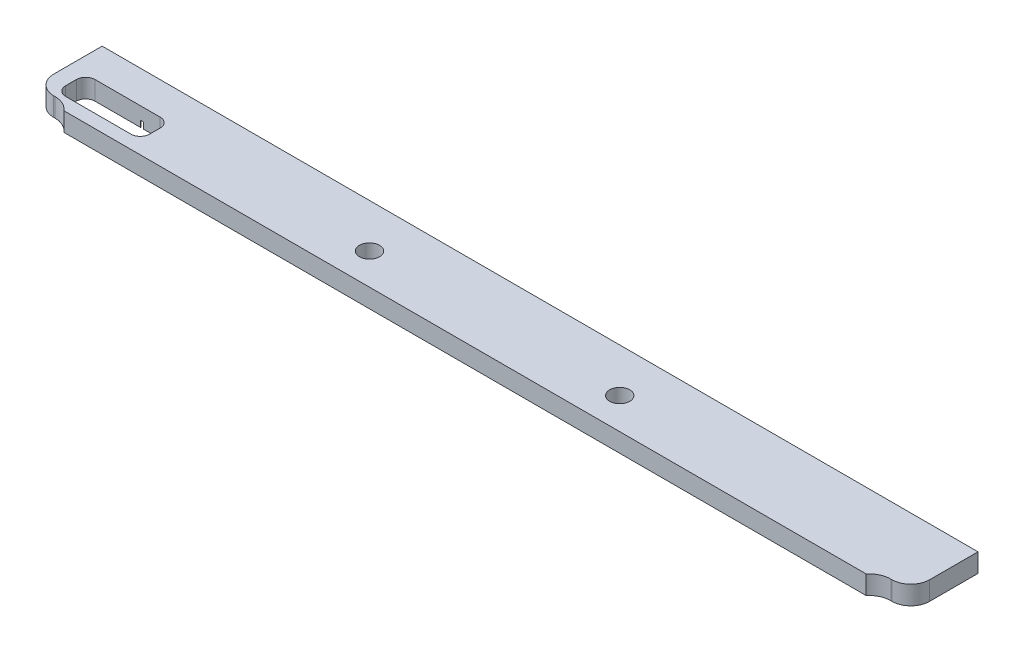
ISO-10303-21;
HEADER;
FILE_DESCRIPTION(('STEP AP214'),'2;1');
FILE_NAME('part.step','',(''),(''),'','','');
FILE_SCHEMA(('AUTOMOTIVE_DESIGN { 1 0 10303 214 1 1 1 1 }'));
ENDSEC;
DATA;
#1=APPLICATION_CONTEXT('core data for automotive mechanical design processes');
#2=APPLICATION_PROTOCOL_DEFINITION('international standard','automotive_design',2000,#1);
#3=PRODUCT_CONTEXT('',#1,'mechanical');
#4=PRODUCT('Part','Part','',(#3));
#5=PRODUCT_RELATED_PRODUCT_CATEGORY('part','',(#4));
#6=PRODUCT_DEFINITION_FORMATION('','',#4);
#7=PRODUCT_DEFINITION_CONTEXT('part definition',#1,'design');
#8=PRODUCT_DEFINITION('design','',#6,#7);
#9=PRODUCT_DEFINITION_SHAPE('','',#8);
#10=(LENGTH_UNIT() NAMED_UNIT(*) SI_UNIT(.MILLI.,.METRE.));
#11=(NAMED_UNIT(*) PLANE_ANGLE_UNIT() SI_UNIT($,.RADIAN.));
#12=(NAMED_UNIT(*) SI_UNIT($,.STERADIAN.) SOLID_ANGLE_UNIT());
#13=UNCERTAINTY_MEASURE_WITH_UNIT(LENGTH_MEASURE(1.E-05),#10,'distance_accuracy_value','');
#14=(GEOMETRIC_REPRESENTATION_CONTEXT(3) GLOBAL_UNCERTAINTY_ASSIGNED_CONTEXT((#13)) GLOBAL_UNIT_ASSIGNED_CONTEXT((#10,
#11,#12)) REPRESENTATION_CONTEXT('',''));
#15=CARTESIAN_POINT('',(0.,0.,0.));
#16=DIRECTION('',(0.,0.,1.));
#17=DIRECTION('',(1.,0.,0.));
#18=AXIS2_PLACEMENT_3D('',#15,#16,#17);
#19=CARTESIAN_POINT('',(-5.62533214977497,0.,33.8347475130993));
#20=DIRECTION('',(0.,1.,0.));
#21=DIRECTION('',(0.,0.,1.));
#22=AXIS2_PLACEMENT_3D('',#19,#20,#21);
#23=PLANE('',#22);
#24=CARTESIAN_POINT('',(41.1097970990968,0.,33.0968859332185));
#25=DIRECTION('',(0.,1.,0.));
#26=DIRECTION('',(0.,0.,1.));
#27=AXIS2_PLACEMENT_3D('',#24,#25,#26);
#28=CIRCLE('',#27,1.6);
#29=CARTESIAN_POINT('',(41.1097970990968,0.,34.6968859332185));
#30=VERTEX_POINT('',#29);
#31=EDGE_CURVE('E671',#30,#30,#28,.F.);
#32=ORIENTED_EDGE('',*,*,#31,.F.);
#33=EDGE_LOOP('',(#32));
#34=FACE_BOUND('',#33,.T.);
#35=CARTESIAN_POINT('',(81.1097970990968,0.,33.0968859332185));
#36=DIRECTION('',(0.,1.,0.));
#37=DIRECTION('',(0.,0.,1.));
#38=AXIS2_PLACEMENT_3D('',#35,#36,#37);
#39=CIRCLE('',#38,1.6);
#40=CARTESIAN_POINT('',(81.1097970990968,0.,34.6968859332185));
#41=VERTEX_POINT('',#40);
#42=EDGE_CURVE('E676',#41,#41,#39,.F.);
#43=ORIENTED_EDGE('',*,*,#42,.F.);
#44=EDGE_LOOP('',(#43));
#45=FACE_BOUND('',#44,.T.);
#46=DIRECTION('',(0.683776631973393,0.,0.729691385153425));
#47=VECTOR('',#46,1.);
#48=CARTESIAN_POINT('',(1.60172455198447,0.,30.0757379310663));
#49=LINE('',#48,#47);
#50=CARTESIAN_POINT('',(1.60172455198447,0.,30.0757379310663));
#51=VERTEX_POINT('',#50);
#52=CARTESIAN_POINT('',(2.7354308495141,0.,31.285571201054));
#53=VERTEX_POINT('',#52);
#54=EDGE_CURVE('E263',#51,#53,#49,.T.);
#55=ORIENTED_EDGE('',*,*,#54,.T.);
#56=DIRECTION('',(1.,0.,0.));
#57=VECTOR('',#56,1.);
#58=CARTESIAN_POINT('',(5.85211333838372,0.,31.285571201054));
#59=LINE('',#58,#57);
#60=CARTESIAN_POINT('',(-4.56579067789085,0.,31.285571201054));
#61=VERTEX_POINT('',#60);
#62=EDGE_CURVE('E214',#61,#53,#59,.T.);
#63=ORIENTED_EDGE('',*,*,#62,.F.);
#64=CARTESIAN_POINT('',(-4.56579067789086,0.,32.785571201054));
#65=DIRECTION('',(0.,1.,0.));
#66=DIRECTION('',(0.,0.,1.));
#67=AXIS2_PLACEMENT_3D('',#64,#65,#66);
#68=CIRCLE('',#67,1.5);
#69=CARTESIAN_POINT('',(-6.06579067789086,0.,32.785571201054));
#70=VERTEX_POINT('',#69);
#71=EDGE_CURVE('E195',#70,#61,#68,.F.);
#72=ORIENTED_EDGE('',*,*,#71,.F.);
#73=DIRECTION('',(0.,0.,-1.));
#74=VECTOR('',#73,1.);
#75=CARTESIAN_POINT('',(-6.06579067789086,0.,32.785571201054));
#76=LINE('',#75,#74);
#77=CARTESIAN_POINT('',(-6.06579067789086,0.,34.4773805031897));
#78=VERTEX_POINT('',#77);
#79=EDGE_CURVE('E204',#78,#70,#76,.T.);
#80=ORIENTED_EDGE('',*,*,#79,.F.);
#81=CARTESIAN_POINT('',(-4.56579067789086,0.,34.4773805031897));
#82=DIRECTION('',(0.,1.,0.));
#83=DIRECTION('',(0.,0.,1.));
#84=AXIS2_PLACEMENT_3D('',#81,#82,#83);
#85=CIRCLE('',#84,1.5);
#86=CARTESIAN_POINT('',(-4.56579067789086,0.,35.9773805031897));
#87=VERTEX_POINT('',#86);
#88=EDGE_CURVE('E672',#87,#78,#85,.F.);
#89=ORIENTED_EDGE('',*,*,#88,.F.);
#90=DIRECTION('',(-1.,0.,0.));
#91=VECTOR('',#90,1.);
#92=CARTESIAN_POINT('',(-4.56579067789085,0.,35.9773805031897));
#93=LINE('',#92,#91);
#94=CARTESIAN_POINT('',(5.85211333838372,0.,35.9773805031897));
#95=VERTEX_POINT('',#94);
#96=EDGE_CURVE('E674',#95,#87,#93,.T.);
#97=ORIENTED_EDGE('',*,*,#96,.F.);
#98=CARTESIAN_POINT('',(5.85211333838373,0.,34.4773805031897));
#99=DIRECTION('',(0.,1.,0.));
#100=DIRECTION('',(0.,0.,1.));
#101=AXIS2_PLACEMENT_3D('',#98,#99,#100);
#102=CIRCLE('',#101,1.5);
#103=CARTESIAN_POINT('',(7.35211333838373,0.,34.4773805031897));
#104=VERTEX_POINT('',#103);
#105=EDGE_CURVE('E686',#104,#95,#102,.F.);
#106=ORIENTED_EDGE('',*,*,#105,.F.);
#107=DIRECTION('',(0.,0.,1.));
#108=VECTOR('',#107,1.);
#109=CARTESIAN_POINT('',(7.35211333838373,0.,34.4773805031897));
#110=LINE('',#109,#108);
#111=CARTESIAN_POINT('',(7.35211333838373,0.,32.785571201054));
#112=VERTEX_POINT('',#111);
#113=EDGE_CURVE('E689',#112,#104,#110,.T.);
#114=ORIENTED_EDGE('',*,*,#113,.F.);
#115=CARTESIAN_POINT('',(5.85211333838373,0.,32.785571201054));
#116=DIRECTION('',(0.,1.,0.));
#117=DIRECTION('',(0.,0.,1.));
#118=AXIS2_PLACEMENT_3D('',#115,#116,#117);
#119=CIRCLE('',#118,1.5);
#120=CARTESIAN_POINT('',(5.85211333838372,0.,31.285571201054));
#121=VERTEX_POINT('',#120);
#122=EDGE_CURVE('E219',#121,#112,#119,.F.);
#123=ORIENTED_EDGE('',*,*,#122,.F.);
#124=CARTESIAN_POINT('',(3.14976479731387,0.,31.285571201054));
#125=VERTEX_POINT('',#124);
#126=EDGE_CURVE('E215',#125,#121,#59,.T.);
#127=ORIENTED_EDGE('',*,*,#126,.F.);
#128=DIRECTION('',(-0.684013993569679,0.,-0.729468886657176));
#129=VECTOR('',#128,1.);
#130=CARTESIAN_POINT('',(3.22762599429216,0.,31.3686065208099));
#131=LINE('',#130,#129);
#132=CARTESIAN_POINT('',(2.35192487249729,0.,30.4347122900407));
#133=VERTEX_POINT('',#132);
#134=EDGE_CURVE('E259',#125,#133,#131,.T.);
#135=ORIENTED_EDGE('',*,*,#134,.T.);
#136=DIRECTION('',(1.,0.,0.));
#137=VECTOR('',#136,1.);
#138=CARTESIAN_POINT('',(2.35192487249729,0.,30.4347122900407));
#139=LINE('',#138,#137);
#140=CARTESIAN_POINT('',(3.9799296801896,0.,30.4347122900407));
#141=VERTEX_POINT('',#140);
#142=EDGE_CURVE('E274',#133,#141,#139,.T.);
#143=ORIENTED_EDGE('',*,*,#142,.T.);
#144=DIRECTION('',(0.,0.,-1.));
#145=VECTOR('',#144,1.);
#146=CARTESIAN_POINT('',(3.9799296801896,0.,30.4347122900407));
#147=LINE('',#146,#145);
#148=CARTESIAN_POINT('',(3.9799296801896,0.,30.0757379310663));
#149=VERTEX_POINT('',#148);
#150=EDGE_CURVE('E277',#141,#149,#147,.T.);
#151=ORIENTED_EDGE('',*,*,#150,.T.);
#152=DIRECTION('',(-1.,0.,0.));
#153=VECTOR('',#152,1.);
#154=CARTESIAN_POINT('',(3.9799296801896,0.,30.0757379310663));
#155=LINE('',#154,#153);
#156=EDGE_CURVE('E280',#149,#51,#155,.T.);
#157=ORIENTED_EDGE('',*,*,#156,.T.);
#158=EDGE_LOOP('',(#55,#63,#72,#80,#89,#97,#106,#114,#123,#127,#135,#143,#151,#157));
#159=FACE_BOUND('',#158,.T.);
#160=DIRECTION('',(0.,0.,-1.));
#161=VECTOR('',#160,1.);
#162=CARTESIAN_POINT('',(131.374667850225,0.,33.8347475130993));
#163=LINE('',#162,#161);
#164=CARTESIAN_POINT('',(131.374667850225,0.,33.8347475130993));
#165=VERTEX_POINT('',#164);
#166=CARTESIAN_POINT('',(131.374667850225,0.,26.0937676510456));
#167=VERTEX_POINT('',#166);
#168=EDGE_CURVE('E292',#165,#167,#163,.T.);
#169=ORIENTED_EDGE('',*,*,#168,.F.);
#170=CARTESIAN_POINT('',(128.374667850225,0.,33.8347475130993));
#171=DIRECTION('',(0.,1.,0.));
#172=DIRECTION('',(0.,0.,1.));
#173=AXIS2_PLACEMENT_3D('',#170,#171,#172);
#174=CIRCLE('',#173,3.);
#175=CARTESIAN_POINT('',(128.374667850225,0.,36.8347475130993));
#176=VERTEX_POINT('',#175);
#177=EDGE_CURVE('E297',#176,#165,#174,.T.);
#178=ORIENTED_EDGE('',*,*,#177,.F.);
#179=DIRECTION('',(1.,0.,0.));
#180=VECTOR('',#179,1.);
#181=CARTESIAN_POINT('',(128.180358537518,0.,36.8347475130993));
#182=LINE('',#181,#180);
#183=CARTESIAN_POINT('',(128.180358537518,0.,36.8347475130993));
#184=VERTEX_POINT('',#183);
#185=EDGE_CURVE('E332',#184,#176,#182,.T.);
#186=ORIENTED_EDGE('',*,*,#185,.F.);
#187=CARTESIAN_POINT('',(128.180358537518,0.,40.3347475130993));
#188=DIRECTION('',(0.,-1.,0.));
#189=DIRECTION('',(0.,0.,1.));
#190=AXIS2_PLACEMENT_3D('',#187,#188,#189);
#191=CIRCLE('',#190,3.5);
#192=CARTESIAN_POINT('',(125.490280150114,0.,38.0956677312206));
#193=VERTEX_POINT('',#192);
#194=EDGE_CURVE('E330',#193,#184,#191,.T.);
#195=ORIENTED_EDGE('',*,*,#194,.F.);
#196=DIRECTION('',(1.,0.,0.));
#197=VECTOR('',#196,1.);
#198=CARTESIAN_POINT('',(-2.74094444966362,0.,38.0956677312206));
#199=LINE('',#198,#197);
#200=CARTESIAN_POINT('',(-2.74094444966362,0.,38.0956677312206));
#201=VERTEX_POINT('',#200);
#202=EDGE_CURVE('E328',#201,#193,#199,.T.);
#203=ORIENTED_EDGE('',*,*,#202,.F.);
#204=CARTESIAN_POINT('',(-5.43102283706829,0.,40.3347475130993));
#205=DIRECTION('',(0.,-1.,0.));
#206=DIRECTION('',(0.,0.,1.));
#207=AXIS2_PLACEMENT_3D('',#204,#205,#206);
#208=CIRCLE('',#207,3.5);
#209=CARTESIAN_POINT('',(-5.43102283706831,0.,36.8347475130993));
#210=VERTEX_POINT('',#209);
#211=EDGE_CURVE('E326',#210,#201,#208,.T.);
#212=ORIENTED_EDGE('',*,*,#211,.F.);
#213=DIRECTION('',(1.,0.,0.));
#214=VECTOR('',#213,1.);
#215=CARTESIAN_POINT('',(-5.62533214977498,0.,36.8347475130993));
#216=LINE('',#215,#214);
#217=CARTESIAN_POINT('',(-5.62533214977497,0.,36.8347475130993));
#218=VERTEX_POINT('',#217);
#219=EDGE_CURVE('E324',#218,#210,#216,.T.);
#220=ORIENTED_EDGE('',*,*,#219,.F.);
#221=CARTESIAN_POINT('',(-5.62533214977497,0.,33.8347475130993));
#222=DIRECTION('',(0.,1.,0.));
#223=DIRECTION('',(0.,0.,1.));
#224=AXIS2_PLACEMENT_3D('',#221,#222,#223);
#225=CIRCLE('',#224,3.);
#226=CARTESIAN_POINT('',(-8.62533214977497,0.,33.8347475130993));
#227=VERTEX_POINT('',#226);
#228=EDGE_CURVE('E322',#227,#218,#225,.T.);
#229=ORIENTED_EDGE('',*,*,#228,.F.);
#230=DIRECTION('',(0.,0.,1.));
#231=VECTOR('',#230,1.);
#232=CARTESIAN_POINT('',(-8.62533214977497,0.,26.0937676510456));
#233=LINE('',#232,#231);
#234=CARTESIAN_POINT('',(-8.62533214977497,0.,26.0937676510456));
#235=VERTEX_POINT('',#234);
#236=EDGE_CURVE('E320',#235,#227,#233,.T.);
#237=ORIENTED_EDGE('',*,*,#236,.F.);
#238=DIRECTION('',(-1.,0.,0.));
#239=VECTOR('',#238,1.);
#240=CARTESIAN_POINT('',(131.374667850225,0.,26.0937676510456));
#241=LINE('',#240,#239);
#242=EDGE_CURVE('E318',#167,#235,#241,.T.);
#243=ORIENTED_EDGE('',*,*,#242,.F.);
#244=EDGE_LOOP('',(#169,#178,#186,#195,#203,#212,#220,#229,#237,#243));
#245=FACE_BOUND('',#244,.T.);
#246=ADVANCED_FACE('F32',(#34,#45,#159,#245),#23,.F.);
#247=CARTESIAN_POINT('',(131.374667850225,3.,33.8347475130993));
#248=DIRECTION('',(-1.,0.,0.));
#249=DIRECTION('',(0.,0.,1.));
#250=AXIS2_PLACEMENT_3D('',#247,#248,#249);
#251=PLANE('',#250);
#252=ORIENTED_EDGE('',*,*,#168,.T.);
#253=DIRECTION('',(0.,-1.,0.));
#254=VECTOR('',#253,1.);
#255=CARTESIAN_POINT('',(131.374667850225,3.,26.0937676510456));
#256=LINE('',#255,#254);
#257=CARTESIAN_POINT('',(131.374667850225,3.,26.0937676510456));
#258=VERTEX_POINT('',#257);
#259=EDGE_CURVE('E11',#258,#167,#256,.T.);
#260=ORIENTED_EDGE('',*,*,#259,.F.);
#261=DIRECTION('',(0.,0.,-1.));
#262=VECTOR('',#261,1.);
#263=CARTESIAN_POINT('',(131.374667850225,3.,33.8347475130993));
#264=LINE('',#263,#262);
#265=CARTESIAN_POINT('',(131.374667850225,3.,33.8347475130993));
#266=VERTEX_POINT('',#265);
#267=EDGE_CURVE('E293',#266,#258,#264,.T.);
#268=ORIENTED_EDGE('',*,*,#267,.F.);
#269=DIRECTION('',(0.,-1.,0.));
#270=VECTOR('',#269,1.);
#271=CARTESIAN_POINT('',(131.374667850225,3.,33.8347475130993));
#272=LINE('',#271,#270);
#273=EDGE_CURVE('E315',#266,#165,#272,.T.);
#274=ORIENTED_EDGE('',*,*,#273,.T.);
#275=EDGE_LOOP('',(#252,#260,#268,#274));
#276=FACE_BOUND('',#275,.T.);
#277=ADVANCED_FACE('F34',(#276),#251,.F.);
#278=CARTESIAN_POINT('',(131.374667850225,3.,26.0937676510456));
#279=DIRECTION('',(0.,0.,1.));
#280=DIRECTION('',(1.,0.,0.));
#281=AXIS2_PLACEMENT_3D('',#278,#279,#280);
#282=PLANE('',#281);
#283=ORIENTED_EDGE('',*,*,#242,.T.);
#284=DIRECTION('',(0.,-1.,0.));
#285=VECTOR('',#284,1.);
#286=CARTESIAN_POINT('',(-8.62533214977497,3.,26.0937676510456));
#287=LINE('',#286,#285);
#288=CARTESIAN_POINT('',(-8.62533214977497,3.,26.0937676510456));
#289=VERTEX_POINT('',#288);
#290=EDGE_CURVE('E40',#289,#235,#287,.T.);
#291=ORIENTED_EDGE('',*,*,#290,.F.);
#292=DIRECTION('',(-1.,0.,0.));
#293=VECTOR('',#292,1.);
#294=CARTESIAN_POINT('',(131.374667850225,3.,26.0937676510456));
#295=LINE('',#294,#293);
#296=EDGE_CURVE('E296',#258,#289,#295,.T.);
#297=ORIENTED_EDGE('',*,*,#296,.F.);
#298=ORIENTED_EDGE('',*,*,#259,.T.);
#299=EDGE_LOOP('',(#283,#291,#297,#298));
#300=FACE_BOUND('',#299,.T.);
#301=ADVANCED_FACE('F383',(#300),#282,.F.);
#302=CARTESIAN_POINT('',(-8.62533214977497,3.,26.0937676510456));
#303=DIRECTION('',(1.,0.,0.));
#304=DIRECTION('',(0.,0.,-1.));
#305=AXIS2_PLACEMENT_3D('',#302,#303,#304);
#306=PLANE('',#305);
#307=ORIENTED_EDGE('',*,*,#236,.T.);
#308=DIRECTION('',(0.,-1.,0.));
#309=VECTOR('',#308,1.);
#310=CARTESIAN_POINT('',(-8.62533214977497,3.,33.8347475130993));
#311=LINE('',#310,#309);
#312=CARTESIAN_POINT('',(-8.62533214977497,3.,33.8347475130993));
#313=VERTEX_POINT('',#312);
#314=EDGE_CURVE('E355',#313,#227,#311,.T.);
#315=ORIENTED_EDGE('',*,*,#314,.F.);
#316=DIRECTION('',(0.,0.,1.));
#317=VECTOR('',#316,1.);
#318=CARTESIAN_POINT('',(-8.62533214977497,3.,26.0937676510456));
#319=LINE('',#318,#317);
#320=EDGE_CURVE('E299',#289,#313,#319,.T.);
#321=ORIENTED_EDGE('',*,*,#320,.F.);
#322=ORIENTED_EDGE('',*,*,#290,.T.);
#323=EDGE_LOOP('',(#307,#315,#321,#322));
#324=FACE_BOUND('',#323,.T.);
#325=ADVANCED_FACE('F362',(#324),#306,.F.);
#326=CARTESIAN_POINT('',(-5.62533214977497,3.,33.8347475130993));
#327=DIRECTION('',(0.,-1.,0.));
#328=DIRECTION('',(0.,0.,-1.));
#329=AXIS2_PLACEMENT_3D('',#326,#327,#328);
#330=CYLINDRICAL_SURFACE('',#329,3.);
#331=ORIENTED_EDGE('',*,*,#228,.T.);
#332=DIRECTION('',(0.,-1.,0.));
#333=VECTOR('',#332,1.);
#334=CARTESIAN_POINT('',(-5.62533214977497,3.,36.8347475130993));
#335=LINE('',#334,#333);
#336=CARTESIAN_POINT('',(-5.62533214977497,3.,36.8347475130993));
#337=VERTEX_POINT('',#336);
#338=EDGE_CURVE('E352',#337,#218,#335,.T.);
#339=ORIENTED_EDGE('',*,*,#338,.F.);
#340=CARTESIAN_POINT('',(-5.62533214977497,3.,33.8347475130993));
#341=DIRECTION('',(0.,1.,0.));
#342=DIRECTION('',(0.,0.,1.));
#343=AXIS2_PLACEMENT_3D('',#340,#341,#342);
#344=CIRCLE('',#343,3.);
#345=EDGE_CURVE('E301',#313,#337,#344,.T.);
#346=ORIENTED_EDGE('',*,*,#345,.F.);
#347=ORIENTED_EDGE('',*,*,#314,.T.);
#348=EDGE_LOOP('',(#331,#339,#346,#347));
#349=FACE_BOUND('',#348,.T.);
#350=ADVANCED_FACE('F371',(#349),#330,.T.);
#351=CARTESIAN_POINT('',(-5.62533214977498,3.,36.8347475130993));
#352=DIRECTION('',(0.,0.,-1.));
#353=DIRECTION('',(-1.,0.,0.));
#354=AXIS2_PLACEMENT_3D('',#351,#352,#353);
#355=PLANE('',#354);
#356=ORIENTED_EDGE('',*,*,#219,.T.);
#357=DIRECTION('',(0.,-1.,0.));
#358=VECTOR('',#357,1.);
#359=CARTESIAN_POINT('',(-5.43102283706831,3.,36.8347475130993));
#360=LINE('',#359,#358);
#361=CARTESIAN_POINT('',(-5.43102283706831,3.,36.8347475130993));
#362=VERTEX_POINT('',#361);
#363=EDGE_CURVE('E349',#362,#210,#360,.T.);
#364=ORIENTED_EDGE('',*,*,#363,.F.);
#365=DIRECTION('',(1.,0.,0.));
#366=VECTOR('',#365,1.);
#367=CARTESIAN_POINT('',(-5.62533214977498,3.,36.8347475130993));
#368=LINE('',#367,#366);
#369=EDGE_CURVE('E303',#337,#362,#368,.T.);
#370=ORIENTED_EDGE('',*,*,#369,.F.);
#371=ORIENTED_EDGE('',*,*,#338,.T.);
#372=EDGE_LOOP('',(#356,#364,#370,#371));
#373=FACE_BOUND('',#372,.T.);
#374=ADVANCED_FACE('F375',(#373),#355,.F.);
#375=CARTESIAN_POINT('',(-5.43102283706829,3.,40.3347475130993));
#376=DIRECTION('',(0.,-1.,0.));
#377=DIRECTION('',(0.,0.,-1.));
#378=AXIS2_PLACEMENT_3D('',#375,#376,#377);
#379=CYLINDRICAL_SURFACE('',#378,3.5);
#380=ORIENTED_EDGE('',*,*,#211,.T.);
#381=DIRECTION('',(0.,-1.,0.));
#382=VECTOR('',#381,1.);
#383=CARTESIAN_POINT('',(-2.74094444966362,3.,38.0956677312206));
#384=LINE('',#383,#382);
#385=CARTESIAN_POINT('',(-2.74094444966362,3.,38.0956677312206));
#386=VERTEX_POINT('',#385);
#387=EDGE_CURVE('E346',#386,#201,#384,.T.);
#388=ORIENTED_EDGE('',*,*,#387,.F.);
#389=CARTESIAN_POINT('',(-5.43102283706829,3.,40.3347475130993));
#390=DIRECTION('',(0.,-1.,0.));
#391=DIRECTION('',(0.,0.,1.));
#392=AXIS2_PLACEMENT_3D('',#389,#390,#391);
#393=CIRCLE('',#392,3.5);
#394=EDGE_CURVE('E305',#362,#386,#393,.T.);
#395=ORIENTED_EDGE('',*,*,#394,.F.);
#396=ORIENTED_EDGE('',*,*,#363,.T.);
#397=EDGE_LOOP('',(#380,#388,#395,#396));
#398=FACE_BOUND('',#397,.T.);
#399=ADVANCED_FACE('F406',(#398),#379,.F.);
#400=CARTESIAN_POINT('',(-2.74094444966362,3.,38.0956677312206));
#401=DIRECTION('',(0.,0.,-1.));
#402=DIRECTION('',(-1.,0.,0.));
#403=AXIS2_PLACEMENT_3D('',#400,#401,#402);
#404=PLANE('',#403);
#405=ORIENTED_EDGE('',*,*,#202,.T.);
#406=DIRECTION('',(0.,-1.,0.));
#407=VECTOR('',#406,1.);
#408=CARTESIAN_POINT('',(125.490280150114,3.,38.0956677312206));
#409=LINE('',#408,#407);
#410=CARTESIAN_POINT('',(125.490280150114,3.,38.0956677312206));
#411=VERTEX_POINT('',#410);
#412=EDGE_CURVE('E343',#411,#193,#409,.T.);
#413=ORIENTED_EDGE('',*,*,#412,.F.);
#414=DIRECTION('',(1.,0.,0.));
#415=VECTOR('',#414,1.);
#416=CARTESIAN_POINT('',(-2.74094444966362,3.,38.0956677312206));
#417=LINE('',#416,#415);
#418=EDGE_CURVE('E307',#386,#411,#417,.T.);
#419=ORIENTED_EDGE('',*,*,#418,.F.);
#420=ORIENTED_EDGE('',*,*,#387,.T.);
#421=EDGE_LOOP('',(#405,#413,#419,#420));
#422=FACE_BOUND('',#421,.T.);
#423=ADVANCED_FACE('F403',(#422),#404,.F.);
#424=CARTESIAN_POINT('',(128.180358537518,3.,40.3347475130993));
#425=DIRECTION('',(0.,-1.,0.));
#426=DIRECTION('',(0.,0.,-1.));
#427=AXIS2_PLACEMENT_3D('',#424,#425,#426);
#428=CYLINDRICAL_SURFACE('',#427,3.5);
#429=ORIENTED_EDGE('',*,*,#194,.T.);
#430=DIRECTION('',(0.,-1.,0.));
#431=VECTOR('',#430,1.);
#432=CARTESIAN_POINT('',(128.180358537518,3.,36.8347475130993));
#433=LINE('',#432,#431);
#434=CARTESIAN_POINT('',(128.180358537518,3.,36.8347475130993));
#435=VERTEX_POINT('',#434);
#436=EDGE_CURVE('E340',#435,#184,#433,.T.);
#437=ORIENTED_EDGE('',*,*,#436,.F.);
#438=CARTESIAN_POINT('',(128.180358537518,3.,40.3347475130993));
#439=DIRECTION('',(0.,-1.,0.));
#440=DIRECTION('',(0.,0.,1.));
#441=AXIS2_PLACEMENT_3D('',#438,#439,#440);
#442=CIRCLE('',#441,3.5);
#443=EDGE_CURVE('E309',#411,#435,#442,.T.);
#444=ORIENTED_EDGE('',*,*,#443,.F.);
#445=ORIENTED_EDGE('',*,*,#412,.T.);
#446=EDGE_LOOP('',(#429,#437,#444,#445));
#447=FACE_BOUND('',#446,.T.);
#448=ADVANCED_FACE('F399',(#447),#428,.F.);
#449=CARTESIAN_POINT('',(128.180358537518,3.,36.8347475130993));
#450=DIRECTION('',(0.,0.,-1.));
#451=DIRECTION('',(-1.,0.,0.));
#452=AXIS2_PLACEMENT_3D('',#449,#450,#451);
#453=PLANE('',#452);
#454=ORIENTED_EDGE('',*,*,#185,.T.);
#455=DIRECTION('',(0.,-1.,0.));
#456=VECTOR('',#455,1.);
#457=CARTESIAN_POINT('',(128.374667850225,3.,36.8347475130993));
#458=LINE('',#457,#456);
#459=CARTESIAN_POINT('',(128.374667850225,3.,36.8347475130993));
#460=VERTEX_POINT('',#459);
#461=EDGE_CURVE('E337',#460,#176,#458,.T.);
#462=ORIENTED_EDGE('',*,*,#461,.F.);
#463=DIRECTION('',(1.,0.,0.));
#464=VECTOR('',#463,1.);
#465=CARTESIAN_POINT('',(128.180358537518,3.,36.8347475130993));
#466=LINE('',#465,#464);
#467=EDGE_CURVE('E311',#435,#460,#466,.T.);
#468=ORIENTED_EDGE('',*,*,#467,.F.);
#469=ORIENTED_EDGE('',*,*,#436,.T.);
#470=EDGE_LOOP('',(#454,#462,#468,#469));
#471=FACE_BOUND('',#470,.T.);
#472=ADVANCED_FACE('F395',(#471),#453,.F.);
#473=CARTESIAN_POINT('',(128.374667850225,3.,33.8347475130993));
#474=DIRECTION('',(0.,-1.,0.));
#475=DIRECTION('',(0.,0.,-1.));
#476=AXIS2_PLACEMENT_3D('',#473,#474,#475);
#477=CYLINDRICAL_SURFACE('',#476,3.);
#478=ORIENTED_EDGE('',*,*,#177,.T.);
#479=ORIENTED_EDGE('',*,*,#273,.F.);
#480=CARTESIAN_POINT('',(128.374667850225,3.,33.8347475130993));
#481=DIRECTION('',(0.,1.,0.));
#482=DIRECTION('',(0.,0.,1.));
#483=AXIS2_PLACEMENT_3D('',#480,#481,#482);
#484=CIRCLE('',#483,3.);
#485=EDGE_CURVE('E313',#460,#266,#484,.T.);
#486=ORIENTED_EDGE('',*,*,#485,.F.);
#487=ORIENTED_EDGE('',*,*,#461,.T.);
#488=EDGE_LOOP('',(#478,#479,#486,#487));
#489=FACE_BOUND('',#488,.T.);
#490=ADVANCED_FACE('F390',(#489),#477,.T.);
#491=CARTESIAN_POINT('',(-5.62533214977497,3.,33.8347475130993));
#492=DIRECTION('',(0.,1.,0.));
#493=DIRECTION('',(0.,0.,1.));
#494=AXIS2_PLACEMENT_3D('',#491,#492,#493);
#495=PLANE('',#494);
#496=CARTESIAN_POINT('',(41.1097970990968,3.,33.0968859332185));
#497=DIRECTION('',(0.,1.,0.));
#498=DIRECTION('',(0.,0.,1.));
#499=AXIS2_PLACEMENT_3D('',#496,#497,#498);
#500=CIRCLE('',#499,1.6);
#501=CARTESIAN_POINT('',(41.1097970990968,3.,34.6968859332185));
#502=VERTEX_POINT('',#501);
#503=EDGE_CURVE('E669',#502,#502,#500,.T.);
#504=ORIENTED_EDGE('',*,*,#503,.F.);
#505=EDGE_LOOP('',(#504));
#506=FACE_BOUND('',#505,.T.);
#507=CARTESIAN_POINT('',(81.1097970990968,3.,33.0968859332185));
#508=DIRECTION('',(0.,1.,0.));
#509=DIRECTION('',(0.,0.,1.));
#510=AXIS2_PLACEMENT_3D('',#507,#508,#509);
#511=CIRCLE('',#510,1.6);
#512=CARTESIAN_POINT('',(81.1097970990968,3.,34.6968859332185));
#513=VERTEX_POINT('',#512);
#514=EDGE_CURVE('E679',#513,#513,#511,.T.);
#515=ORIENTED_EDGE('',*,*,#514,.F.);
#516=EDGE_LOOP('',(#515));
#517=FACE_BOUND('',#516,.T.);
#518=CARTESIAN_POINT('',(-4.56579067789086,3.,32.785571201054));
#519=DIRECTION('',(0.,1.,0.));
#520=DIRECTION('',(0.,0.,1.));
#521=AXIS2_PLACEMENT_3D('',#518,#519,#520);
#522=CIRCLE('',#521,1.5);
#523=CARTESIAN_POINT('',(-4.56579067789085,3.,31.285571201054));
#524=VERTEX_POINT('',#523);
#525=CARTESIAN_POINT('',(-6.06579067789086,3.,32.785571201054));
#526=VERTEX_POINT('',#525);
#527=EDGE_CURVE('E47',#524,#526,#522,.T.);
#528=ORIENTED_EDGE('',*,*,#527,.F.);
#529=DIRECTION('',(-1.,0.,0.));
#530=VECTOR('',#529,1.);
#531=CARTESIAN_POINT('',(5.85211333838372,3.,31.285571201054));
#532=LINE('',#531,#530);
#533=CARTESIAN_POINT('',(5.85211333838372,3.,31.285571201054));
#534=VERTEX_POINT('',#533);
#535=EDGE_CURVE('E201',#534,#524,#532,.T.);
#536=ORIENTED_EDGE('',*,*,#535,.F.);
#537=CARTESIAN_POINT('',(5.85211333838373,3.,32.785571201054));
#538=DIRECTION('',(0.,1.,0.));
#539=DIRECTION('',(0.,0.,1.));
#540=AXIS2_PLACEMENT_3D('',#537,#538,#539);
#541=CIRCLE('',#540,1.5);
#542=CARTESIAN_POINT('',(7.35211333838373,3.,32.785571201054));
#543=VERTEX_POINT('',#542);
#544=EDGE_CURVE('E237',#543,#534,#541,.T.);
#545=ORIENTED_EDGE('',*,*,#544,.F.);
#546=DIRECTION('',(0.,0.,-1.));
#547=VECTOR('',#546,1.);
#548=CARTESIAN_POINT('',(7.35211333838373,3.,34.4773805031897));
#549=LINE('',#548,#547);
#550=CARTESIAN_POINT('',(7.35211333838373,3.,34.4773805031897));
#551=VERTEX_POINT('',#550);
#552=EDGE_CURVE('E234',#551,#543,#549,.T.);
#553=ORIENTED_EDGE('',*,*,#552,.F.);
#554=CARTESIAN_POINT('',(5.85211333838373,3.,34.4773805031897));
#555=DIRECTION('',(0.,1.,0.));
#556=DIRECTION('',(0.,0.,1.));
#557=AXIS2_PLACEMENT_3D('',#554,#555,#556);
#558=CIRCLE('',#557,1.5);
#559=CARTESIAN_POINT('',(5.85211333838372,3.,35.9773805031897));
#560=VERTEX_POINT('',#559);
#561=EDGE_CURVE('E231',#560,#551,#558,.T.);
#562=ORIENTED_EDGE('',*,*,#561,.F.);
#563=DIRECTION('',(1.,0.,0.));
#564=VECTOR('',#563,1.);
#565=CARTESIAN_POINT('',(-4.56579067789085,3.,35.9773805031897));
#566=LINE('',#565,#564);
#567=CARTESIAN_POINT('',(-4.56579067789086,3.,35.9773805031897));
#568=VERTEX_POINT('',#567);
#569=EDGE_CURVE('E228',#568,#560,#566,.T.);
#570=ORIENTED_EDGE('',*,*,#569,.F.);
#571=CARTESIAN_POINT('',(-4.56579067789086,3.,34.4773805031897));
#572=DIRECTION('',(0.,1.,0.));
#573=DIRECTION('',(0.,0.,1.));
#574=AXIS2_PLACEMENT_3D('',#571,#572,#573);
#575=CIRCLE('',#574,1.5);
#576=CARTESIAN_POINT('',(-6.06579067789086,3.,34.4773805031897));
#577=VERTEX_POINT('',#576);
#578=EDGE_CURVE('E225',#577,#568,#575,.T.);
#579=ORIENTED_EDGE('',*,*,#578,.F.);
#580=DIRECTION('',(0.,0.,1.));
#581=VECTOR('',#580,1.);
#582=CARTESIAN_POINT('',(-6.06579067789086,3.,32.785571201054));
#583=LINE('',#582,#581);
#584=EDGE_CURVE('E223',#526,#577,#583,.T.);
#585=ORIENTED_EDGE('',*,*,#584,.F.);
#586=EDGE_LOOP('',(#528,#536,#545,#553,#562,#570,#579,#585));
#587=FACE_BOUND('',#586,.T.);
#588=ORIENTED_EDGE('',*,*,#267,.T.);
#589=ORIENTED_EDGE('',*,*,#296,.T.);
#590=ORIENTED_EDGE('',*,*,#320,.T.);
#591=ORIENTED_EDGE('',*,*,#345,.T.);
#592=ORIENTED_EDGE('',*,*,#369,.T.);
#593=ORIENTED_EDGE('',*,*,#394,.T.);
#594=ORIENTED_EDGE('',*,*,#418,.T.);
#595=ORIENTED_EDGE('',*,*,#443,.T.);
#596=ORIENTED_EDGE('',*,*,#467,.T.);
#597=ORIENTED_EDGE('',*,*,#485,.T.);
#598=EDGE_LOOP('',(#588,#589,#590,#591,#592,#593,#594,#595,#596,#597));
#599=FACE_BOUND('',#598,.T.);
#600=ADVANCED_FACE('F379',(#506,#517,#587,#599),#495,.T.);
#601=CARTESIAN_POINT('',(3.22762599429216,1.,31.3686065208099));
#602=DIRECTION('',(-0.729468886657176,0.,0.684013993569679));
#603=DIRECTION('',(0.684013993569679,0.,0.729468886657176));
#604=AXIS2_PLACEMENT_3D('',#601,#602,#603);
#605=PLANE('',#604);
#606=DIRECTION('',(0.,1.,0.));
#607=VECTOR('',#606,1.);
#608=CARTESIAN_POINT('',(3.14976479731387,-0.00100000000000013,31.285571201054));
#609=LINE('',#608,#607);
#610=CARTESIAN_POINT('',(3.14976479731387,1.,31.285571201054));
#611=VERTEX_POINT('',#610);
#612=EDGE_CURVE('E256',#125,#611,#609,.T.);
#613=ORIENTED_EDGE('',*,*,#612,.T.);
#614=DIRECTION('',(-0.684013993569679,0.,-0.729468886657176));
#615=VECTOR('',#614,1.);
#616=CARTESIAN_POINT('',(3.22762599429216,1.,31.3686065208099));
#617=LINE('',#616,#615);
#618=CARTESIAN_POINT('',(2.35192487249729,1.,30.4347122900407));
#619=VERTEX_POINT('',#618);
#620=EDGE_CURVE('E260',#611,#619,#617,.T.);
#621=ORIENTED_EDGE('',*,*,#620,.T.);
#622=DIRECTION('',(0.,-1.,0.));
#623=VECTOR('',#622,1.);
#624=CARTESIAN_POINT('',(2.35192487249729,1.,30.4347122900407));
#625=LINE('',#624,#623);
#626=EDGE_CURVE('E289',#619,#133,#625,.T.);
#627=ORIENTED_EDGE('',*,*,#626,.T.);
#628=ORIENTED_EDGE('',*,*,#134,.F.);
#629=EDGE_LOOP('',(#613,#621,#627,#628));
#630=FACE_BOUND('',#629,.T.);
#631=ADVANCED_FACE('F450',(#630),#605,.T.);
#632=CARTESIAN_POINT('',(2.35192487249729,1.,30.4347122900407));
#633=DIRECTION('',(0.,0.,-1.));
#634=DIRECTION('',(-1.,0.,0.));
#635=AXIS2_PLACEMENT_3D('',#632,#633,#634);
#636=PLANE('',#635);
#637=ORIENTED_EDGE('',*,*,#142,.F.);
#638=ORIENTED_EDGE('',*,*,#626,.F.);
#639=DIRECTION('',(1.,0.,0.));
#640=VECTOR('',#639,1.);
#641=CARTESIAN_POINT('',(2.35192487249729,1.,30.4347122900407));
#642=LINE('',#641,#640);
#643=CARTESIAN_POINT('',(3.9799296801896,1.,30.4347122900407));
#644=VERTEX_POINT('',#643);
#645=EDGE_CURVE('E262',#619,#644,#642,.T.);
#646=ORIENTED_EDGE('',*,*,#645,.T.);
#647=DIRECTION('',(0.,-1.,0.));
#648=VECTOR('',#647,1.);
#649=CARTESIAN_POINT('',(3.9799296801896,1.,30.4347122900407));
#650=LINE('',#649,#648);
#651=EDGE_CURVE('E287',#644,#141,#650,.T.);
#652=ORIENTED_EDGE('',*,*,#651,.T.);
#653=EDGE_LOOP('',(#637,#638,#646,#652));
#654=FACE_BOUND('',#653,.T.);
#655=ADVANCED_FACE('F458',(#654),#636,.T.);
#656=CARTESIAN_POINT('',(3.9799296801896,1.,30.4347122900407));
#657=DIRECTION('',(-1.,0.,0.));
#658=DIRECTION('',(0.,0.,1.));
#659=AXIS2_PLACEMENT_3D('',#656,#657,#658);
#660=PLANE('',#659);
#661=ORIENTED_EDGE('',*,*,#150,.F.);
#662=ORIENTED_EDGE('',*,*,#651,.F.);
#663=DIRECTION('',(0.,0.,-1.));
#664=VECTOR('',#663,1.);
#665=CARTESIAN_POINT('',(3.9799296801896,1.,30.4347122900407));
#666=LINE('',#665,#664);
#667=CARTESIAN_POINT('',(3.9799296801896,1.,30.0757379310663));
#668=VERTEX_POINT('',#667);
#669=EDGE_CURVE('E265',#644,#668,#666,.T.);
#670=ORIENTED_EDGE('',*,*,#669,.T.);
#671=DIRECTION('',(0.,-1.,0.));
#672=VECTOR('',#671,1.);
#673=CARTESIAN_POINT('',(3.9799296801896,1.,30.0757379310663));
#674=LINE('',#673,#672);
#675=EDGE_CURVE('E285',#668,#149,#674,.T.);
#676=ORIENTED_EDGE('',*,*,#675,.T.);
#677=EDGE_LOOP('',(#661,#662,#670,#676));
#678=FACE_BOUND('',#677,.T.);
#679=ADVANCED_FACE('F466',(#678),#660,.T.);
#680=CARTESIAN_POINT('',(3.9799296801896,1.,30.0757379310663));
#681=DIRECTION('',(0.,0.,1.));
#682=DIRECTION('',(1.,0.,0.));
#683=AXIS2_PLACEMENT_3D('',#680,#681,#682);
#684=PLANE('',#683);
#685=ORIENTED_EDGE('',*,*,#156,.F.);
#686=ORIENTED_EDGE('',*,*,#675,.F.);
#687=DIRECTION('',(-1.,0.,0.));
#688=VECTOR('',#687,1.);
#689=CARTESIAN_POINT('',(3.9799296801896,1.,30.0757379310663));
#690=LINE('',#689,#688);
#691=CARTESIAN_POINT('',(1.60172455198447,1.,30.0757379310663));
#692=VERTEX_POINT('',#691);
#693=EDGE_CURVE('E267',#668,#692,#690,.T.);
#694=ORIENTED_EDGE('',*,*,#693,.T.);
#695=DIRECTION('',(0.,-1.,0.));
#696=VECTOR('',#695,1.);
#697=CARTESIAN_POINT('',(1.60172455198447,1.,30.0757379310663));
#698=LINE('',#697,#696);
#699=EDGE_CURVE('E272',#692,#51,#698,.T.);
#700=ORIENTED_EDGE('',*,*,#699,.T.);
#701=EDGE_LOOP('',(#685,#686,#694,#700));
#702=FACE_BOUND('',#701,.T.);
#703=ADVANCED_FACE('F474',(#702),#684,.T.);
#704=CARTESIAN_POINT('',(1.60172455198447,1.,30.0757379310663));
#705=DIRECTION('',(0.729691385153425,0.,-0.683776631973393));
#706=DIRECTION('',(-0.683776631973392,0.,-0.729691385153425));
#707=AXIS2_PLACEMENT_3D('',#704,#705,#706);
#708=PLANE('',#707);
#709=DIRECTION('',(0.,-1.,0.));
#710=VECTOR('',#709,1.);
#711=CARTESIAN_POINT('',(2.7354308495141,-0.00100000000000013,31.285571201054));
#712=LINE('',#711,#710);
#713=CARTESIAN_POINT('',(2.7354308495141,1.,31.285571201054));
#714=VERTEX_POINT('',#713);
#715=EDGE_CURVE('E55',#714,#53,#712,.T.);
#716=ORIENTED_EDGE('',*,*,#715,.T.);
#717=ORIENTED_EDGE('',*,*,#54,.F.);
#718=ORIENTED_EDGE('',*,*,#699,.F.);
#719=DIRECTION('',(0.683776631973393,0.,0.729691385153425));
#720=VECTOR('',#719,1.);
#721=CARTESIAN_POINT('',(1.60172455198447,1.,30.0757379310663));
#722=LINE('',#721,#720);
#723=EDGE_CURVE('E269',#692,#714,#722,.T.);
#724=ORIENTED_EDGE('',*,*,#723,.T.);
#725=EDGE_LOOP('',(#716,#717,#718,#724));
#726=FACE_BOUND('',#725,.T.);
#727=ADVANCED_FACE('F481',(#726),#708,.T.);
#728=CARTESIAN_POINT('',(2.28595074954363,1.,33.07679834374));
#729=DIRECTION('',(0.,1.,0.));
#730=DIRECTION('',(0.,0.,1.));
#731=AXIS2_PLACEMENT_3D('',#728,#729,#730);
#732=PLANE('',#731);
#733=ORIENTED_EDGE('',*,*,#620,.F.);
#734=DIRECTION('',(1.,0.,0.));
#735=VECTOR('',#734,1.);
#736=CARTESIAN_POINT('',(5.85211333838372,1.,31.285571201054));
#737=LINE('',#736,#735);
#738=EDGE_CURVE('E209',#714,#611,#737,.T.);
#739=ORIENTED_EDGE('',*,*,#738,.F.);
#740=ORIENTED_EDGE('',*,*,#723,.F.);
#741=ORIENTED_EDGE('',*,*,#693,.F.);
#742=ORIENTED_EDGE('',*,*,#669,.F.);
#743=ORIENTED_EDGE('',*,*,#645,.F.);
#744=EDGE_LOOP('',(#733,#739,#740,#741,#742,#743));
#745=FACE_BOUND('',#744,.T.);
#746=ADVANCED_FACE('F488',(#745),#732,.F.);
#747=CARTESIAN_POINT('',(-4.56579067789086,-0.00100000000000013,32.785571201054));
#748=DIRECTION('',(0.,1.,0.));
#749=DIRECTION('',(0.,0.,1.));
#750=AXIS2_PLACEMENT_3D('',#747,#748,#749);
#751=CYLINDRICAL_SURFACE('',#750,1.5);
#752=ORIENTED_EDGE('',*,*,#71,.T.);
#753=DIRECTION('',(0.,1.,0.));
#754=VECTOR('',#753,1.);
#755=CARTESIAN_POINT('',(-4.56579067789085,-0.00100000000000013,31.285571201054));
#756=LINE('',#755,#754);
#757=EDGE_CURVE('E210',#61,#524,#756,.T.);
#758=ORIENTED_EDGE('',*,*,#757,.T.);
#759=ORIENTED_EDGE('',*,*,#527,.T.);
#760=DIRECTION('',(0.,1.,0.));
#761=VECTOR('',#760,1.);
#762=CARTESIAN_POINT('',(-6.06579067789086,-0.00100000000000013,32.785571201054));
#763=LINE('',#762,#761);
#764=EDGE_CURVE('E191',#70,#526,#763,.T.);
#765=ORIENTED_EDGE('',*,*,#764,.F.);
#766=EDGE_LOOP('',(#752,#758,#759,#765));
#767=FACE_BOUND('',#766,.T.);
#768=ADVANCED_FACE('F193',(#767),#751,.F.);
#769=CARTESIAN_POINT('',(5.85211333838372,-0.00100000000000013,31.285571201054));
#770=DIRECTION('',(0.,0.,-1.));
#771=DIRECTION('',(-1.,0.,0.));
#772=AXIS2_PLACEMENT_3D('',#769,#770,#771);
#773=PLANE('',#772);
#774=ORIENTED_EDGE('',*,*,#62,.T.);
#775=ORIENTED_EDGE('',*,*,#715,.F.);
#776=ORIENTED_EDGE('',*,*,#738,.T.);
#777=ORIENTED_EDGE('',*,*,#612,.F.);
#778=ORIENTED_EDGE('',*,*,#126,.T.);
#779=DIRECTION('',(0.,1.,0.));
#780=VECTOR('',#779,1.);
#781=CARTESIAN_POINT('',(5.85211333838372,-0.00100000000000013,31.285571201054));
#782=LINE('',#781,#780);
#783=EDGE_CURVE('E243',#121,#534,#782,.T.);
#784=ORIENTED_EDGE('',*,*,#783,.T.);
#785=ORIENTED_EDGE('',*,*,#535,.T.);
#786=ORIENTED_EDGE('',*,*,#757,.F.);
#787=EDGE_LOOP('',(#774,#775,#776,#777,#778,#784,#785,#786));
#788=FACE_BOUND('',#787,.T.);
#789=ADVANCED_FACE('F503',(#788),#773,.F.);
#790=CARTESIAN_POINT('',(5.85211333838373,-0.00100000000000013,32.785571201054));
#791=DIRECTION('',(0.,1.,0.));
#792=DIRECTION('',(0.,0.,1.));
#793=AXIS2_PLACEMENT_3D('',#790,#791,#792);
#794=CYLINDRICAL_SURFACE('',#793,1.5);
#795=ORIENTED_EDGE('',*,*,#122,.T.);
#796=DIRECTION('',(0.,1.,0.));
#797=VECTOR('',#796,1.);
#798=CARTESIAN_POINT('',(7.35211333838373,-0.00100000000000013,32.785571201054));
#799=LINE('',#798,#797);
#800=EDGE_CURVE('E245',#112,#543,#799,.T.);
#801=ORIENTED_EDGE('',*,*,#800,.T.);
#802=ORIENTED_EDGE('',*,*,#544,.T.);
#803=ORIENTED_EDGE('',*,*,#783,.F.);
#804=EDGE_LOOP('',(#795,#801,#802,#803));
#805=FACE_BOUND('',#804,.T.);
#806=ADVANCED_FACE('F510',(#805),#794,.F.);
#807=CARTESIAN_POINT('',(7.35211333838373,-0.00100000000000013,34.4773805031897));
#808=DIRECTION('',(1.,0.,0.));
#809=DIRECTION('',(0.,0.,-1.));
#810=AXIS2_PLACEMENT_3D('',#807,#808,#809);
#811=PLANE('',#810);
#812=ORIENTED_EDGE('',*,*,#113,.T.);
#813=DIRECTION('',(0.,1.,0.));
#814=VECTOR('',#813,1.);
#815=CARTESIAN_POINT('',(7.35211333838373,-0.00100000000000013,34.4773805031897));
#816=LINE('',#815,#814);
#817=EDGE_CURVE('E247',#104,#551,#816,.T.);
#818=ORIENTED_EDGE('',*,*,#817,.T.);
#819=ORIENTED_EDGE('',*,*,#552,.T.);
#820=ORIENTED_EDGE('',*,*,#800,.F.);
#821=EDGE_LOOP('',(#812,#818,#819,#820));
#822=FACE_BOUND('',#821,.T.);
#823=ADVANCED_FACE('F517',(#822),#811,.F.);
#824=CARTESIAN_POINT('',(5.85211333838373,-0.00100000000000013,34.4773805031897));
#825=DIRECTION('',(0.,1.,0.));
#826=DIRECTION('',(0.,0.,1.));
#827=AXIS2_PLACEMENT_3D('',#824,#825,#826);
#828=CYLINDRICAL_SURFACE('',#827,1.5);
#829=ORIENTED_EDGE('',*,*,#105,.T.);
#830=DIRECTION('',(0.,1.,0.));
#831=VECTOR('',#830,1.);
#832=CARTESIAN_POINT('',(5.85211333838372,-0.00100000000000013,35.9773805031897));
#833=LINE('',#832,#831);
#834=EDGE_CURVE('E249',#95,#560,#833,.T.);
#835=ORIENTED_EDGE('',*,*,#834,.T.);
#836=ORIENTED_EDGE('',*,*,#561,.T.);
#837=ORIENTED_EDGE('',*,*,#817,.F.);
#838=EDGE_LOOP('',(#829,#835,#836,#837));
#839=FACE_BOUND('',#838,.T.);
#840=ADVANCED_FACE('F525',(#839),#828,.F.);
#841=CARTESIAN_POINT('',(-4.56579067789085,-0.00100000000000013,35.9773805031897));
#842=DIRECTION('',(0.,0.,1.));
#843=DIRECTION('',(1.,0.,0.));
#844=AXIS2_PLACEMENT_3D('',#841,#842,#843);
#845=PLANE('',#844);
#846=ORIENTED_EDGE('',*,*,#96,.T.);
#847=DIRECTION('',(0.,1.,0.));
#848=VECTOR('',#847,1.);
#849=CARTESIAN_POINT('',(-4.56579067789086,-0.00100000000000013,35.9773805031897));
#850=LINE('',#849,#848);
#851=EDGE_CURVE('E251',#87,#568,#850,.T.);
#852=ORIENTED_EDGE('',*,*,#851,.T.);
#853=ORIENTED_EDGE('',*,*,#569,.T.);
#854=ORIENTED_EDGE('',*,*,#834,.F.);
#855=EDGE_LOOP('',(#846,#852,#853,#854));
#856=FACE_BOUND('',#855,.T.);
#857=ADVANCED_FACE('F533',(#856),#845,.F.);
#858=CARTESIAN_POINT('',(-4.56579067789086,-0.00100000000000013,34.4773805031897));
#859=DIRECTION('',(0.,1.,0.));
#860=DIRECTION('',(0.,0.,1.));
#861=AXIS2_PLACEMENT_3D('',#858,#859,#860);
#862=CYLINDRICAL_SURFACE('',#861,1.5);
#863=ORIENTED_EDGE('',*,*,#88,.T.);
#864=DIRECTION('',(0.,1.,0.));
#865=VECTOR('',#864,1.);
#866=CARTESIAN_POINT('',(-6.06579067789086,-0.00100000000000013,34.4773805031897));
#867=LINE('',#866,#865);
#868=EDGE_CURVE('E200',#78,#577,#867,.T.);
#869=ORIENTED_EDGE('',*,*,#868,.T.);
#870=ORIENTED_EDGE('',*,*,#578,.T.);
#871=ORIENTED_EDGE('',*,*,#851,.F.);
#872=EDGE_LOOP('',(#863,#869,#870,#871));
#873=FACE_BOUND('',#872,.T.);
#874=ADVANCED_FACE('F541',(#873),#862,.F.);
#875=CARTESIAN_POINT('',(-6.06579067789086,-0.00100000000000013,32.785571201054));
#876=DIRECTION('',(-1.,0.,0.));
#877=DIRECTION('',(0.,0.,1.));
#878=AXIS2_PLACEMENT_3D('',#875,#876,#877);
#879=PLANE('',#878);
#880=ORIENTED_EDGE('',*,*,#79,.T.);
#881=ORIENTED_EDGE('',*,*,#764,.T.);
#882=ORIENTED_EDGE('',*,*,#584,.T.);
#883=ORIENTED_EDGE('',*,*,#868,.F.);
#884=EDGE_LOOP('',(#880,#881,#882,#883));
#885=FACE_BOUND('',#884,.T.);
#886=ADVANCED_FACE('F205',(#885),#879,.F.);
#887=CARTESIAN_POINT('',(81.1097970990968,-0.00100000000000013,33.0968859332185));
#888=DIRECTION('',(0.,1.,0.));
#889=DIRECTION('',(0.,0.,1.));
#890=AXIS2_PLACEMENT_3D('',#887,#888,#889);
#891=CYLINDRICAL_SURFACE('',#890,1.6);
#892=CARTESIAN_POINT('',(81.1097970990968,3.,34.6968859332185));
#893=CARTESIAN_POINT('',(81.1097970990968,2.96875,34.6968859332185));
#894=CARTESIAN_POINT('',(81.1097970990968,2.9375,34.6968859332185));
#895=CARTESIAN_POINT('',(81.1097970990968,2.875,34.6968859332185));
#896=CARTESIAN_POINT('',(81.1097970990968,2.84375,34.6968859332185));
#897=CARTESIAN_POINT('',(81.1097970990968,2.78125,34.6968859332185));
#898=CARTESIAN_POINT('',(81.1097970990968,2.75,34.6968859332185));
#899=CARTESIAN_POINT('',(81.1097970990968,2.6875,34.6968859332185));
#900=CARTESIAN_POINT('',(81.1097970990968,2.65625,34.6968859332185));
#901=CARTESIAN_POINT('',(81.1097970990968,2.59375,34.6968859332185));
#902=CARTESIAN_POINT('',(81.1097970990968,2.5625,34.6968859332185));
#903=CARTESIAN_POINT('',(81.1097970990968,2.5,34.6968859332185));
#904=CARTESIAN_POINT('',(81.1097970990968,2.46875,34.6968859332185));
#905=CARTESIAN_POINT('',(81.1097970990968,2.40625,34.6968859332185));
#906=CARTESIAN_POINT('',(81.1097970990968,2.375,34.6968859332185));
#907=CARTESIAN_POINT('',(81.1097970990968,2.3125,34.6968859332185));
#908=CARTESIAN_POINT('',(81.1097970990968,2.28125,34.6968859332185));
#909=CARTESIAN_POINT('',(81.1097970990968,2.21875,34.6968859332185));
#910=CARTESIAN_POINT('',(81.1097970990968,2.1875,34.6968859332185));
#911=CARTESIAN_POINT('',(81.1097970990968,2.125,34.6968859332185));
#912=CARTESIAN_POINT('',(81.1097970990968,2.09375,34.6968859332185));
#913=CARTESIAN_POINT('',(81.1097970990968,2.03125,34.6968859332185));
#914=CARTESIAN_POINT('',(81.1097970990968,2.,34.6968859332185));
#915=CARTESIAN_POINT('',(81.1097970990968,1.9375,34.6968859332185));
#916=CARTESIAN_POINT('',(81.1097970990968,1.90625,34.6968859332185));
#917=CARTESIAN_POINT('',(81.1097970990968,1.84375,34.6968859332185));
#918=CARTESIAN_POINT('',(81.1097970990968,1.8125,34.6968859332185));
#919=CARTESIAN_POINT('',(81.1097970990968,1.75,34.6968859332185));
#920=CARTESIAN_POINT('',(81.1097970990968,1.71875,34.6968859332185));
#921=CARTESIAN_POINT('',(81.1097970990968,1.65625,34.6968859332185));
#922=CARTESIAN_POINT('',(81.1097970990968,1.625,34.6968859332185));
#923=CARTESIAN_POINT('',(81.1097970990968,1.5625,34.6968859332185));
#924=CARTESIAN_POINT('',(81.1097970990968,1.53125,34.6968859332185));
#925=CARTESIAN_POINT('',(81.1097970990968,1.46875,34.6968859332185));
#926=CARTESIAN_POINT('',(81.1097970990968,1.4375,34.6968859332185));
#927=CARTESIAN_POINT('',(81.1097970990968,1.375,34.6968859332185));
#928=CARTESIAN_POINT('',(81.1097970990968,1.34375,34.6968859332185));
#929=CARTESIAN_POINT('',(81.1097970990968,1.28125,34.6968859332185));
#930=CARTESIAN_POINT('',(81.1097970990968,1.25,34.6968859332185));
#931=CARTESIAN_POINT('',(81.1097970990968,1.1875,34.6968859332185));
#932=CARTESIAN_POINT('',(81.1097970990968,1.15625,34.6968859332185));
#933=CARTESIAN_POINT('',(81.1097970990968,1.09375,34.6968859332185));
#934=CARTESIAN_POINT('',(81.1097970990968,1.0625,34.6968859332185));
#935=CARTESIAN_POINT('',(81.1097970990968,1.,34.6968859332185));
#936=CARTESIAN_POINT('',(81.1097970990968,0.96875,34.6968859332185));
#937=CARTESIAN_POINT('',(81.1097970990968,0.90625,34.6968859332185));
#938=CARTESIAN_POINT('',(81.1097970990968,0.875,34.6968859332185));
#939=CARTESIAN_POINT('',(81.1097970990968,0.8125,34.6968859332185));
#940=CARTESIAN_POINT('',(81.1097970990968,0.78125,34.6968859332185));
#941=CARTESIAN_POINT('',(81.1097970990968,0.71875,34.6968859332185));
#942=CARTESIAN_POINT('',(81.1097970990968,0.6875,34.6968859332185));
#943=CARTESIAN_POINT('',(81.1097970990968,0.625,34.6968859332185));
#944=CARTESIAN_POINT('',(81.1097970990968,0.59375,34.6968859332185));
#945=CARTESIAN_POINT('',(81.1097970990968,0.53125,34.6968859332185));
#946=CARTESIAN_POINT('',(81.1097970990968,0.5,34.6968859332185));
#947=CARTESIAN_POINT('',(81.1097970990968,0.4375,34.6968859332185));
#948=CARTESIAN_POINT('',(81.1097970990968,0.40625,34.6968859332185));
#949=CARTESIAN_POINT('',(81.1097970990968,0.34375,34.6968859332185));
#950=CARTESIAN_POINT('',(81.1097970990968,0.3125,34.6968859332185));
#951=CARTESIAN_POINT('',(81.1097970990968,0.25,34.6968859332185));
#952=CARTESIAN_POINT('',(81.1097970990968,0.21875,34.6968859332185));
#953=CARTESIAN_POINT('',(81.1097970990968,0.15625,34.6968859332185));
#954=CARTESIAN_POINT('',(81.1097970990968,0.125,34.6968859332185));
#955=CARTESIAN_POINT('',(81.1097970990968,0.0625000000000001,34.6968859332185));
#956=CARTESIAN_POINT('',(81.1097970990968,0.0312500000000001,34.6968859332185));
#957=CARTESIAN_POINT('',(81.1097970990968,0.,34.6968859332185));
#958=B_SPLINE_CURVE_WITH_KNOTS('',3,(#892,#893,#894,#895,#896,#897,#898,#899,#900,#901,#902,
#903,#904,#905,#906,#907,#908,#909,#910,#911,#912,#913,#914,#915,#916,#917,#918,#919,#920,#921,
#922,#923,#924,#925,#926,#927,#928,#929,#930,#931,#932,#933,#934,#935,#936,#937,#938,#939,#940,
#941,#942,#943,#944,#945,#946,#947,#948,#949,#950,#951,#952,#953,#954,#955,#956,#957),
.UNSPECIFIED.,.F.,.F.,(4,2,2,2,2,2,2,2,2,2,2,2,2,2,2,2,2,2,2,2,2,2,2,2,2,2,2,2,2,2,2,2,4),(0.,
0.0937500000000001,0.1875,0.28125,0.375,0.46875,0.5625,0.65625,0.75,0.84375,0.9375,1.03125,
1.125,1.21875,1.3125,1.40625,1.5,1.59375,1.6875,1.78125,1.875,1.96875,2.0625,2.15625,2.25,
2.34375,2.4375,2.53125,2.625,2.71875,2.8125,2.90625,3.),.UNSPECIFIED.);
#959=EDGE_CURVE('BSEAM556',#513,#41,#958,.T.);
#960=ORIENTED_EDGE('',*,*,#514,.T.);
#961=ORIENTED_EDGE('',*,*,#42,.T.);
#962=ORIENTED_EDGE('',*,*,#959,.T.);
#963=ORIENTED_EDGE('',*,*,#959,.F.);
#964=EDGE_LOOP('',(#960,#962,#961,#963));
#965=FACE_BOUND('',#964,.T.);
#966=ADVANCED_FACE('F556',(#965),#891,.F.);
#967=CARTESIAN_POINT('',(41.1097970990968,-0.00100000000000013,33.0968859332185));
#968=DIRECTION('',(0.,1.,0.));
#969=DIRECTION('',(0.,0.,1.));
#970=AXIS2_PLACEMENT_3D('',#967,#968,#969);
#971=CYLINDRICAL_SURFACE('',#970,1.6);
#972=CARTESIAN_POINT('',(41.1097970990968,3.,34.6968859332185));
#973=CARTESIAN_POINT('',(41.1097970990968,2.96875,34.6968859332185));
#974=CARTESIAN_POINT('',(41.1097970990968,2.9375,34.6968859332185));
#975=CARTESIAN_POINT('',(41.1097970990968,2.875,34.6968859332185));
#976=CARTESIAN_POINT('',(41.1097970990968,2.84375,34.6968859332185));
#977=CARTESIAN_POINT('',(41.1097970990968,2.78125,34.6968859332185));
#978=CARTESIAN_POINT('',(41.1097970990968,2.75,34.6968859332185));
#979=CARTESIAN_POINT('',(41.1097970990968,2.6875,34.6968859332185));
#980=CARTESIAN_POINT('',(41.1097970990968,2.65625,34.6968859332185));
#981=CARTESIAN_POINT('',(41.1097970990968,2.59375,34.6968859332185));
#982=CARTESIAN_POINT('',(41.1097970990968,2.5625,34.6968859332185));
#983=CARTESIAN_POINT('',(41.1097970990968,2.5,34.6968859332185));
#984=CARTESIAN_POINT('',(41.1097970990968,2.46875,34.6968859332185));
#985=CARTESIAN_POINT('',(41.1097970990968,2.40625,34.6968859332185));
#986=CARTESIAN_POINT('',(41.1097970990968,2.375,34.6968859332185));
#987=CARTESIAN_POINT('',(41.1097970990968,2.3125,34.6968859332185));
#988=CARTESIAN_POINT('',(41.1097970990968,2.28125,34.6968859332185));
#989=CARTESIAN_POINT('',(41.1097970990968,2.21875,34.6968859332185));
#990=CARTESIAN_POINT('',(41.1097970990968,2.1875,34.6968859332185));
#991=CARTESIAN_POINT('',(41.1097970990968,2.125,34.6968859332185));
#992=CARTESIAN_POINT('',(41.1097970990968,2.09375,34.6968859332185));
#993=CARTESIAN_POINT('',(41.1097970990968,2.03125,34.6968859332185));
#994=CARTESIAN_POINT('',(41.1097970990968,2.,34.6968859332185));
#995=CARTESIAN_POINT('',(41.1097970990968,1.9375,34.6968859332185));
#996=CARTESIAN_POINT('',(41.1097970990968,1.90625,34.6968859332185));
#997=CARTESIAN_POINT('',(41.1097970990968,1.84375,34.6968859332185));
#998=CARTESIAN_POINT('',(41.1097970990968,1.8125,34.6968859332185));
#999=CARTESIAN_POINT('',(41.1097970990968,1.75,34.6968859332185));
#1000=CARTESIAN_POINT('',(41.1097970990968,1.71875,34.6968859332185));
#1001=CARTESIAN_POINT('',(41.1097970990968,1.65625,34.6968859332185));
#1002=CARTESIAN_POINT('',(41.1097970990968,1.625,34.6968859332185));
#1003=CARTESIAN_POINT('',(41.1097970990968,1.5625,34.6968859332185));
#1004=CARTESIAN_POINT('',(41.1097970990968,1.53125,34.6968859332185));
#1005=CARTESIAN_POINT('',(41.1097970990968,1.46875,34.6968859332185));
#1006=CARTESIAN_POINT('',(41.1097970990968,1.4375,34.6968859332185));
#1007=CARTESIAN_POINT('',(41.1097970990968,1.375,34.6968859332185));
#1008=CARTESIAN_POINT('',(41.1097970990968,1.34375,34.6968859332185));
#1009=CARTESIAN_POINT('',(41.1097970990968,1.28125,34.6968859332185));
#1010=CARTESIAN_POINT('',(41.1097970990968,1.25,34.6968859332185));
#1011=CARTESIAN_POINT('',(41.1097970990968,1.1875,34.6968859332185));
#1012=CARTESIAN_POINT('',(41.1097970990968,1.15625,34.6968859332185));
#1013=CARTESIAN_POINT('',(41.1097970990968,1.09375,34.6968859332185));
#1014=CARTESIAN_POINT('',(41.1097970990968,1.0625,34.6968859332185));
#1015=CARTESIAN_POINT('',(41.1097970990968,1.,34.6968859332185));
#1016=CARTESIAN_POINT('',(41.1097970990968,0.96875,34.6968859332185));
#1017=CARTESIAN_POINT('',(41.1097970990968,0.90625,34.6968859332185));
#1018=CARTESIAN_POINT('',(41.1097970990968,0.875,34.6968859332185));
#1019=CARTESIAN_POINT('',(41.1097970990968,0.8125,34.6968859332185));
#1020=CARTESIAN_POINT('',(41.1097970990968,0.78125,34.6968859332185));
#1021=CARTESIAN_POINT('',(41.1097970990968,0.71875,34.6968859332185));
#1022=CARTESIAN_POINT('',(41.1097970990968,0.6875,34.6968859332185));
#1023=CARTESIAN_POINT('',(41.1097970990968,0.625,34.6968859332185));
#1024=CARTESIAN_POINT('',(41.1097970990968,0.59375,34.6968859332185));
#1025=CARTESIAN_POINT('',(41.1097970990968,0.53125,34.6968859332185));
#1026=CARTESIAN_POINT('',(41.1097970990968,0.5,34.6968859332185));
#1027=CARTESIAN_POINT('',(41.1097970990968,0.4375,34.6968859332185));
#1028=CARTESIAN_POINT('',(41.1097970990968,0.40625,34.6968859332185));
#1029=CARTESIAN_POINT('',(41.1097970990968,0.34375,34.6968859332185));
#1030=CARTESIAN_POINT('',(41.1097970990968,0.3125,34.6968859332185));
#1031=CARTESIAN_POINT('',(41.1097970990968,0.25,34.6968859332185));
#1032=CARTESIAN_POINT('',(41.1097970990968,0.21875,34.6968859332185));
#1033=CARTESIAN_POINT('',(41.1097970990968,0.15625,34.6968859332185));
#1034=CARTESIAN_POINT('',(41.1097970990968,0.125,34.6968859332185));
#1035=CARTESIAN_POINT('',(41.1097970990968,0.0625000000000001,34.6968859332185));
#1036=CARTESIAN_POINT('',(41.1097970990968,0.0312500000000001,34.6968859332185));
#1037=CARTESIAN_POINT('',(41.1097970990968,0.,34.6968859332185));
#1038=B_SPLINE_CURVE_WITH_KNOTS('',3,(#972,#973,#974,#975,#976,#977,#978,#979,#980,#981,#982,
#983,#984,#985,#986,#987,#988,#989,#990,#991,#992,#993,#994,#995,#996,#997,#998,#999,#1000,
#1001,#1002,#1003,#1004,#1005,#1006,#1007,#1008,#1009,#1010,#1011,#1012,#1013,#1014,#1015,#1016,
#1017,#1018,#1019,#1020,#1021,#1022,#1023,#1024,#1025,#1026,#1027,#1028,#1029,#1030,#1031,#1032,
#1033,#1034,#1035,#1036,#1037),.UNSPECIFIED.,.F.,.F.,(4,2,2,2,2,2,2,2,2,2,2,2,2,2,2,2,2,2,2,2,2,
2,2,2,2,2,2,2,2,2,2,2,4),(0.,0.0937500000000001,0.1875,0.28125,0.375,0.46875,0.5625,0.65625,
0.75,0.84375,0.9375,1.03125,1.125,1.21875,1.3125,1.40625,1.5,1.59375,1.6875,1.78125,1.875,
1.96875,2.0625,2.15625,2.25,2.34375,2.4375,2.53125,2.625,2.71875,2.8125,2.90625,3.),.UNSPECIFIED.);
#1039=EDGE_CURVE('BSEAM562',#502,#30,#1038,.T.);
#1040=ORIENTED_EDGE('',*,*,#503,.T.);
#1041=ORIENTED_EDGE('',*,*,#31,.T.);
#1042=ORIENTED_EDGE('',*,*,#1039,.T.);
#1043=ORIENTED_EDGE('',*,*,#1039,.F.);
#1044=EDGE_LOOP('',(#1040,#1042,#1041,#1043));
#1045=FACE_BOUND('',#1044,.T.);
#1046=ADVANCED_FACE('F562',(#1045),#971,.F.);
#1047=CLOSED_SHELL('',(#246,#277,#301,#325,#350,#374,#399,#423,#448,#472,#490,#600,#631,#655,
#679,#703,#727,#746,#768,#789,#806,#823,#840,#857,#874,#886,#966,#1046));
#1048=MANIFOLD_SOLID_BREP('B2',#1047);
#1049=ADVANCED_BREP_SHAPE_REPRESENTATION('',(#18,#1048),#14);
#1050=SHAPE_DEFINITION_REPRESENTATION(#9,#1049);
ENDSEC;
END-ISO-10303-21;
